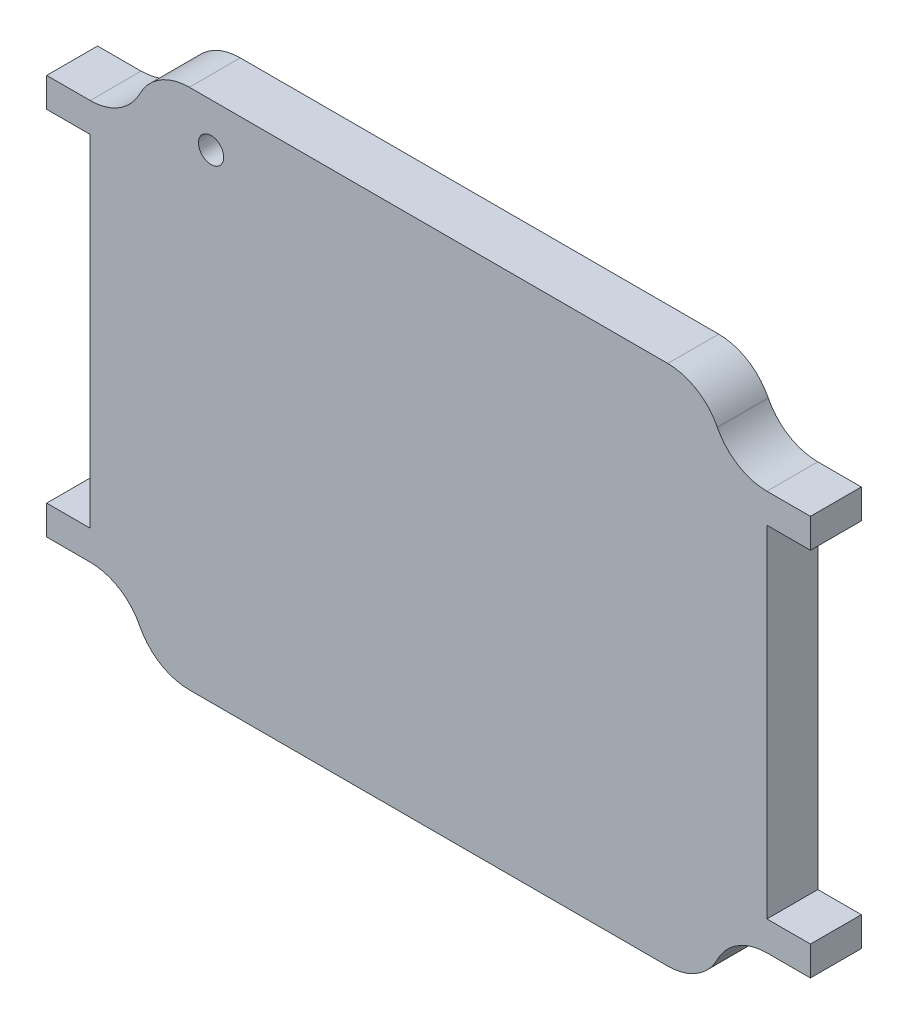
ISO-10303-21;
HEADER;
FILE_DESCRIPTION(('STEP AP214'),'2;1');
FILE_NAME('part.step','',(''),(''),'','','');
FILE_SCHEMA(('AUTOMOTIVE_DESIGN { 1 0 10303 214 1 1 1 1 }'));
ENDSEC;
DATA;
#1=APPLICATION_CONTEXT('core data for automotive mechanical design processes');
#2=APPLICATION_PROTOCOL_DEFINITION('international standard','automotive_design',2000,#1);
#3=PRODUCT_CONTEXT('',#1,'mechanical');
#4=PRODUCT('Part','Part','',(#3));
#5=PRODUCT_RELATED_PRODUCT_CATEGORY('part','',(#4));
#6=PRODUCT_DEFINITION_FORMATION('','',#4);
#7=PRODUCT_DEFINITION_CONTEXT('part definition',#1,'design');
#8=PRODUCT_DEFINITION('design','',#6,#7);
#9=PRODUCT_DEFINITION_SHAPE('','',#8);
#10=(LENGTH_UNIT() NAMED_UNIT(*) SI_UNIT(.MILLI.,.METRE.));
#11=(NAMED_UNIT(*) PLANE_ANGLE_UNIT() SI_UNIT($,.RADIAN.));
#12=(NAMED_UNIT(*) SI_UNIT($,.STERADIAN.) SOLID_ANGLE_UNIT());
#13=UNCERTAINTY_MEASURE_WITH_UNIT(LENGTH_MEASURE(1.E-05),#10,'distance_accuracy_value','');
#14=(GEOMETRIC_REPRESENTATION_CONTEXT(3) GLOBAL_UNCERTAINTY_ASSIGNED_CONTEXT((#13)) GLOBAL_UNIT_ASSIGNED_CONTEXT((#10,
#11,#12)) REPRESENTATION_CONTEXT('',''));
#15=CARTESIAN_POINT('',(0.,0.,0.));
#16=DIRECTION('',(0.,0.,1.));
#17=DIRECTION('',(1.,0.,0.));
#18=AXIS2_PLACEMENT_3D('',#15,#16,#17);
#19=CARTESIAN_POINT('',(-38.9,-29.3632051282051,5.85));
#20=DIRECTION('',(0.,0.,-1.));
#21=DIRECTION('',(-1.,0.,0.));
#22=AXIS2_PLACEMENT_3D('',#19,#20,#21);
#23=PLANE('',#22);
#24=DIRECTION('',(0.,-1.,0.));
#25=VECTOR('',#24,1.);
#26=CARTESIAN_POINT('',(-43.8999999999999,-19.6,5.85));
#27=LINE('',#26,#25);
#28=CARTESIAN_POINT('',(-43.8999999999999,-19.6,5.85));
#29=VERTEX_POINT('',#28);
#30=CARTESIAN_POINT('',(-43.8999999999999,-22.98,5.85));
#31=VERTEX_POINT('',#30);
#32=EDGE_CURVE('E273',#29,#31,#27,.T.);
#33=ORIENTED_EDGE('',*,*,#32,.T.);
#34=DIRECTION('',(1.,0.,0.));
#35=VECTOR('',#34,1.);
#36=CARTESIAN_POINT('',(-43.8999999999999,-22.98,5.85));
#37=LINE('',#36,#35);
#38=CARTESIAN_POINT('',(-38.8999999999999,-22.98,5.85));
#39=VERTEX_POINT('',#38);
#40=EDGE_CURVE('E141',#31,#39,#37,.T.);
#41=ORIENTED_EDGE('',*,*,#40,.T.);
#42=CARTESIAN_POINT('',(-38.9,-29.3632051282051,5.85));
#43=DIRECTION('',(0.,0.,-1.));
#44=DIRECTION('',(-1.,0.,0.));
#45=AXIS2_PLACEMENT_3D('',#42,#43,#44);
#46=CIRCLE('',#45,6.38320512820513);
#47=CARTESIAN_POINT('',(-33.2,-26.49,5.85));
#48=VERTEX_POINT('',#47);
#49=EDGE_CURVE('E336',#39,#48,#46,.T.);
#50=ORIENTED_EDGE('',*,*,#49,.T.);
#51=CARTESIAN_POINT('',(-27.5,-23.6167948717949,5.85));
#52=DIRECTION('',(0.,0.,1.));
#53=DIRECTION('',(1.,0.,0.));
#54=AXIS2_PLACEMENT_3D('',#51,#52,#53);
#55=CIRCLE('',#54,6.38320512820514);
#56=CARTESIAN_POINT('',(-27.5,-30.,5.85));
#57=VERTEX_POINT('',#56);
#58=EDGE_CURVE('E355',#48,#57,#55,.T.);
#59=ORIENTED_EDGE('',*,*,#58,.T.);
#60=DIRECTION('',(1.,0.,0.));
#61=VECTOR('',#60,1.);
#62=CARTESIAN_POINT('',(-27.5,-30.,5.85));
#63=LINE('',#62,#61);
#64=CARTESIAN_POINT('',(27.5,-30.,5.85));
#65=VERTEX_POINT('',#64);
#66=EDGE_CURVE('E352',#57,#65,#63,.T.);
#67=ORIENTED_EDGE('',*,*,#66,.T.);
#68=CARTESIAN_POINT('',(27.5000000000002,-23.6167948717946,5.85));
#69=DIRECTION('',(0.,0.,1.));
#70=DIRECTION('',(-1.,0.,0.));
#71=AXIS2_PLACEMENT_3D('',#68,#69,#70);
#72=CIRCLE('',#71,6.38320512820526);
#73=CARTESIAN_POINT('',(33.2000000000003,-26.4899999999998,5.85));
#74=VERTEX_POINT('',#73);
#75=EDGE_CURVE('E354',#65,#74,#72,.T.);
#76=ORIENTED_EDGE('',*,*,#75,.T.);
#77=CARTESIAN_POINT('',(38.9000000000002,-29.3632051282049,5.85));
#78=DIRECTION('',(0.,0.,-1.));
#79=DIRECTION('',(1.,0.,0.));
#80=AXIS2_PLACEMENT_3D('',#77,#78,#79);
#81=CIRCLE('',#80,6.38320512820514);
#82=CARTESIAN_POINT('',(38.9,-22.9799999999998,5.85));
#83=VERTEX_POINT('',#82);
#84=EDGE_CURVE('E357',#74,#83,#81,.T.);
#85=ORIENTED_EDGE('',*,*,#84,.T.);
#86=DIRECTION('',(1.,0.,0.));
#87=VECTOR('',#86,1.);
#88=CARTESIAN_POINT('',(43.9,-22.9799999999998,5.85));
#89=LINE('',#88,#87);
#90=CARTESIAN_POINT('',(43.9,-22.9799999999998,5.85));
#91=VERTEX_POINT('',#90);
#92=EDGE_CURVE('E363',#83,#91,#89,.T.);
#93=ORIENTED_EDGE('',*,*,#92,.T.);
#94=DIRECTION('',(0.,1.,0.));
#95=VECTOR('',#94,1.);
#96=CARTESIAN_POINT('',(43.9,-19.5999999999998,5.85));
#97=LINE('',#96,#95);
#98=CARTESIAN_POINT('',(43.9,-19.5999999999998,5.85));
#99=VERTEX_POINT('',#98);
#100=EDGE_CURVE('E365',#91,#99,#97,.T.);
#101=ORIENTED_EDGE('',*,*,#100,.T.);
#102=DIRECTION('',(-1.,0.,0.));
#103=VECTOR('',#102,1.);
#104=CARTESIAN_POINT('',(38.9,-19.5999999999998,5.85));
#105=LINE('',#104,#103);
#106=CARTESIAN_POINT('',(38.9,-19.5999999999998,5.85));
#107=VERTEX_POINT('',#106);
#108=EDGE_CURVE('E367',#99,#107,#105,.T.);
#109=ORIENTED_EDGE('',*,*,#108,.T.);
#110=DIRECTION('',(0.,1.,0.));
#111=VECTOR('',#110,1.);
#112=CARTESIAN_POINT('',(38.8999999999997,19.6000000000004,5.85));
#113=LINE('',#112,#111);
#114=CARTESIAN_POINT('',(38.8999999999997,19.6000000000004,5.85));
#115=VERTEX_POINT('',#114);
#116=EDGE_CURVE('E369',#107,#115,#113,.T.);
#117=ORIENTED_EDGE('',*,*,#116,.T.);
#118=DIRECTION('',(1.,0.,0.));
#119=VECTOR('',#118,1.);
#120=CARTESIAN_POINT('',(38.8999999999997,19.6000000000004,5.85));
#121=LINE('',#120,#119);
#122=CARTESIAN_POINT('',(43.8999999999997,19.6000000000004,5.85));
#123=VERTEX_POINT('',#122);
#124=EDGE_CURVE('E371',#115,#123,#121,.T.);
#125=ORIENTED_EDGE('',*,*,#124,.T.);
#126=DIRECTION('',(0.,1.,0.));
#127=VECTOR('',#126,1.);
#128=CARTESIAN_POINT('',(43.8999999999997,19.6000000000004,5.85));
#129=LINE('',#128,#127);
#130=CARTESIAN_POINT('',(43.8999999999997,22.9800000000004,5.85));
#131=VERTEX_POINT('',#130);
#132=EDGE_CURVE('E373',#123,#131,#129,.T.);
#133=ORIENTED_EDGE('',*,*,#132,.T.);
#134=DIRECTION('',(-1.,0.,0.));
#135=VECTOR('',#134,1.);
#136=CARTESIAN_POINT('',(43.8999999999997,22.9800000000004,5.85));
#137=LINE('',#136,#135);
#138=CARTESIAN_POINT('',(38.8999999999997,22.9800000000004,5.85));
#139=VERTEX_POINT('',#138);
#140=EDGE_CURVE('E375',#131,#139,#137,.T.);
#141=ORIENTED_EDGE('',*,*,#140,.T.);
#142=CARTESIAN_POINT('',(38.8999999999998,29.3632051282056,5.85));
#143=DIRECTION('',(0.,0.,-1.));
#144=DIRECTION('',(-1.,0.,0.));
#145=AXIS2_PLACEMENT_3D('',#142,#143,#144);
#146=CIRCLE('',#145,6.38320512820512);
#147=CARTESIAN_POINT('',(33.1999999999998,26.4900000000004,5.85));
#148=VERTEX_POINT('',#147);
#149=EDGE_CURVE('E377',#139,#148,#146,.T.);
#150=ORIENTED_EDGE('',*,*,#149,.T.);
#151=CARTESIAN_POINT('',(27.4999999999998,23.6167948717949,5.85));
#152=DIRECTION('',(0.,0.,1.));
#153=DIRECTION('',(1.,0.,0.));
#154=AXIS2_PLACEMENT_3D('',#151,#152,#153);
#155=CIRCLE('',#154,6.38320512820523);
#156=CARTESIAN_POINT('',(27.5,30.0000000000001,5.85));
#157=VERTEX_POINT('',#156);
#158=EDGE_CURVE('E379',#148,#157,#155,.T.);
#159=ORIENTED_EDGE('',*,*,#158,.T.);
#160=DIRECTION('',(-1.,0.,0.));
#161=VECTOR('',#160,1.);
#162=CARTESIAN_POINT('',(-27.5,30.,5.85));
#163=LINE('',#162,#161);
#164=CARTESIAN_POINT('',(-27.5,30.,5.85));
#165=VERTEX_POINT('',#164);
#166=EDGE_CURVE('E381',#157,#165,#163,.T.);
#167=ORIENTED_EDGE('',*,*,#166,.T.);
#168=CARTESIAN_POINT('',(-27.5,23.6167948717949,5.85));
#169=DIRECTION('',(0.,0.,1.));
#170=DIRECTION('',(-1.,0.,0.));
#171=AXIS2_PLACEMENT_3D('',#168,#169,#170);
#172=CIRCLE('',#171,6.38320512820514);
#173=CARTESIAN_POINT('',(-33.2,26.49,5.85));
#174=VERTEX_POINT('',#173);
#175=EDGE_CURVE('E383',#165,#174,#172,.T.);
#176=ORIENTED_EDGE('',*,*,#175,.T.);
#177=CARTESIAN_POINT('',(-38.9,29.3632051282051,5.85));
#178=DIRECTION('',(0.,0.,-1.));
#179=DIRECTION('',(1.,0.,0.));
#180=AXIS2_PLACEMENT_3D('',#177,#178,#179);
#181=CIRCLE('',#180,6.38320512820513);
#182=CARTESIAN_POINT('',(-38.8999999999999,22.98,5.85));
#183=VERTEX_POINT('',#182);
#184=EDGE_CURVE('E385',#174,#183,#181,.T.);
#185=ORIENTED_EDGE('',*,*,#184,.T.);
#186=DIRECTION('',(-1.,0.,0.));
#187=VECTOR('',#186,1.);
#188=CARTESIAN_POINT('',(-43.8999999999999,22.98,5.85));
#189=LINE('',#188,#187);
#190=CARTESIAN_POINT('',(-43.8999999999999,22.98,5.85));
#191=VERTEX_POINT('',#190);
#192=EDGE_CURVE('E387',#183,#191,#189,.T.);
#193=ORIENTED_EDGE('',*,*,#192,.T.);
#194=DIRECTION('',(0.,-1.,0.));
#195=VECTOR('',#194,1.);
#196=CARTESIAN_POINT('',(-43.8999999999999,19.6,5.85));
#197=LINE('',#196,#195);
#198=CARTESIAN_POINT('',(-43.8999999999999,19.6,5.85));
#199=VERTEX_POINT('',#198);
#200=EDGE_CURVE('E208',#191,#199,#197,.T.);
#201=ORIENTED_EDGE('',*,*,#200,.T.);
#202=DIRECTION('',(1.,0.,0.));
#203=VECTOR('',#202,1.);
#204=CARTESIAN_POINT('',(-38.8999999999999,19.6,5.85));
#205=LINE('',#204,#203);
#206=CARTESIAN_POINT('',(-38.8999999999999,19.6,5.85));
#207=VERTEX_POINT('',#206);
#208=EDGE_CURVE('E202',#199,#207,#205,.T.);
#209=ORIENTED_EDGE('',*,*,#208,.T.);
#210=DIRECTION('',(0.,-1.,0.));
#211=VECTOR('',#210,1.);
#212=CARTESIAN_POINT('',(-38.8999999999999,19.6,5.85));
#213=LINE('',#212,#211);
#214=CARTESIAN_POINT('',(-38.8999999999999,-19.6,5.85));
#215=VERTEX_POINT('',#214);
#216=EDGE_CURVE('E206',#207,#215,#213,.T.);
#217=ORIENTED_EDGE('',*,*,#216,.T.);
#218=DIRECTION('',(-1.,0.,0.));
#219=VECTOR('',#218,1.);
#220=CARTESIAN_POINT('',(-38.8999999999999,-19.6,5.85));
#221=LINE('',#220,#219);
#222=EDGE_CURVE('E50',#215,#29,#221,.T.);
#223=ORIENTED_EDGE('',*,*,#222,.T.);
#224=EDGE_LOOP('',(#33,#41,#50,#59,#67,#76,#85,#93,#101,#109,#117,#125,#133,#141,#150,#159,#167,
#176,#185,#193,#201,#209,#217,#223));
#225=FACE_BOUND('',#224,.T.);
#226=CARTESIAN_POINT('',(-25.,24.9999999999999,5.85));
#227=DIRECTION('',(0.,0.,1.));
#228=DIRECTION('',(1.,0.,0.));
#229=AXIS2_PLACEMENT_3D('',#226,#227,#228);
#230=CIRCLE('',#229,1.45);
#231=CARTESIAN_POINT('',(-23.55,24.9999999999999,5.85));
#232=VERTEX_POINT('',#231);
#233=EDGE_CURVE('E230',#232,#232,#230,.T.);
#234=ORIENTED_EDGE('',*,*,#233,.F.);
#235=EDGE_LOOP('',(#234));
#236=FACE_BOUND('',#235,.T.);
#237=ADVANCED_FACE('F33',(#225,#236),#23,.F.);
#238=CARTESIAN_POINT('',(-38.9,-29.3632051282051,0.));
#239=DIRECTION('',(0.,0.,-1.));
#240=DIRECTION('',(-1.,0.,0.));
#241=AXIS2_PLACEMENT_3D('',#238,#239,#240);
#242=PLANE('',#241);
#243=DIRECTION('',(0.,-1.,0.));
#244=VECTOR('',#243,1.);
#245=CARTESIAN_POINT('',(-43.8999999999999,-19.6,0.));
#246=LINE('',#245,#244);
#247=CARTESIAN_POINT('',(-43.8999999999999,-19.6,0.));
#248=VERTEX_POINT('',#247);
#249=CARTESIAN_POINT('',(-43.8999999999999,-22.98,0.));
#250=VERTEX_POINT('',#249);
#251=EDGE_CURVE('E226',#248,#250,#246,.T.);
#252=ORIENTED_EDGE('',*,*,#251,.F.);
#253=DIRECTION('',(-1.,0.,0.));
#254=VECTOR('',#253,1.);
#255=CARTESIAN_POINT('',(-38.8999999999999,-19.6,0.));
#256=LINE('',#255,#254);
#257=CARTESIAN_POINT('',(-38.8999999999999,-19.6,0.));
#258=VERTEX_POINT('',#257);
#259=EDGE_CURVE('E133',#258,#248,#256,.T.);
#260=ORIENTED_EDGE('',*,*,#259,.F.);
#261=DIRECTION('',(0.,-1.,0.));
#262=VECTOR('',#261,1.);
#263=CARTESIAN_POINT('',(-38.8999999999999,19.6,0.));
#264=LINE('',#263,#262);
#265=CARTESIAN_POINT('',(-38.8999999999999,19.6,0.));
#266=VERTEX_POINT('',#265);
#267=EDGE_CURVE('E127',#266,#258,#264,.T.);
#268=ORIENTED_EDGE('',*,*,#267,.F.);
#269=DIRECTION('',(1.,0.,0.));
#270=VECTOR('',#269,1.);
#271=CARTESIAN_POINT('',(-38.8999999999999,19.6,0.));
#272=LINE('',#271,#270);
#273=CARTESIAN_POINT('',(-43.8999999999999,19.6,0.));
#274=VERTEX_POINT('',#273);
#275=EDGE_CURVE('E216',#274,#266,#272,.T.);
#276=ORIENTED_EDGE('',*,*,#275,.F.);
#277=DIRECTION('',(0.,-1.,0.));
#278=VECTOR('',#277,1.);
#279=CARTESIAN_POINT('',(-43.8999999999999,19.6,0.));
#280=LINE('',#279,#278);
#281=CARTESIAN_POINT('',(-43.8999999999999,22.98,0.));
#282=VERTEX_POINT('',#281);
#283=EDGE_CURVE('E268',#282,#274,#280,.T.);
#284=ORIENTED_EDGE('',*,*,#283,.F.);
#285=DIRECTION('',(-1.,0.,0.));
#286=VECTOR('',#285,1.);
#287=CARTESIAN_POINT('',(-43.8999999999999,22.98,0.));
#288=LINE('',#287,#286);
#289=CARTESIAN_POINT('',(-38.8999999999999,22.98,0.));
#290=VERTEX_POINT('',#289);
#291=EDGE_CURVE('E266',#290,#282,#288,.T.);
#292=ORIENTED_EDGE('',*,*,#291,.F.);
#293=CARTESIAN_POINT('',(-38.9,29.3632051282051,0.));
#294=DIRECTION('',(0.,0.,-1.));
#295=DIRECTION('',(1.,0.,0.));
#296=AXIS2_PLACEMENT_3D('',#293,#294,#295);
#297=CIRCLE('',#296,6.38320512820513);
#298=CARTESIAN_POINT('',(-33.2,26.49,0.));
#299=VERTEX_POINT('',#298);
#300=EDGE_CURVE('E264',#299,#290,#297,.T.);
#301=ORIENTED_EDGE('',*,*,#300,.F.);
#302=CARTESIAN_POINT('',(-27.5,23.6167948717949,0.));
#303=DIRECTION('',(0.,0.,1.));
#304=DIRECTION('',(-1.,0.,0.));
#305=AXIS2_PLACEMENT_3D('',#302,#303,#304);
#306=CIRCLE('',#305,6.38320512820514);
#307=CARTESIAN_POINT('',(-27.5,30.,0.));
#308=VERTEX_POINT('',#307);
#309=EDGE_CURVE('E262',#308,#299,#306,.T.);
#310=ORIENTED_EDGE('',*,*,#309,.F.);
#311=DIRECTION('',(-1.,0.,0.));
#312=VECTOR('',#311,1.);
#313=CARTESIAN_POINT('',(-27.5,30.,0.));
#314=LINE('',#313,#312);
#315=CARTESIAN_POINT('',(27.5,30.0000000000001,0.));
#316=VERTEX_POINT('',#315);
#317=EDGE_CURVE('E260',#316,#308,#314,.T.);
#318=ORIENTED_EDGE('',*,*,#317,.F.);
#319=CARTESIAN_POINT('',(27.4999999999998,23.6167948717949,0.));
#320=DIRECTION('',(0.,0.,1.));
#321=DIRECTION('',(1.,0.,0.));
#322=AXIS2_PLACEMENT_3D('',#319,#320,#321);
#323=CIRCLE('',#322,6.38320512820523);
#324=CARTESIAN_POINT('',(33.1999999999998,26.4900000000004,0.));
#325=VERTEX_POINT('',#324);
#326=EDGE_CURVE('E258',#325,#316,#323,.T.);
#327=ORIENTED_EDGE('',*,*,#326,.F.);
#328=CARTESIAN_POINT('',(38.8999999999998,29.3632051282056,0.));
#329=DIRECTION('',(0.,0.,-1.));
#330=DIRECTION('',(-1.,0.,0.));
#331=AXIS2_PLACEMENT_3D('',#328,#329,#330);
#332=CIRCLE('',#331,6.38320512820512);
#333=CARTESIAN_POINT('',(38.8999999999997,22.9800000000004,0.));
#334=VERTEX_POINT('',#333);
#335=EDGE_CURVE('E256',#334,#325,#332,.T.);
#336=ORIENTED_EDGE('',*,*,#335,.F.);
#337=DIRECTION('',(-1.,0.,0.));
#338=VECTOR('',#337,1.);
#339=CARTESIAN_POINT('',(43.8999999999997,22.9800000000004,0.));
#340=LINE('',#339,#338);
#341=CARTESIAN_POINT('',(43.8999999999997,22.9800000000004,0.));
#342=VERTEX_POINT('',#341);
#343=EDGE_CURVE('E254',#342,#334,#340,.T.);
#344=ORIENTED_EDGE('',*,*,#343,.F.);
#345=DIRECTION('',(0.,1.,0.));
#346=VECTOR('',#345,1.);
#347=CARTESIAN_POINT('',(43.8999999999997,19.6000000000004,0.));
#348=LINE('',#347,#346);
#349=CARTESIAN_POINT('',(43.8999999999997,19.6000000000004,0.));
#350=VERTEX_POINT('',#349);
#351=EDGE_CURVE('E252',#350,#342,#348,.T.);
#352=ORIENTED_EDGE('',*,*,#351,.F.);
#353=DIRECTION('',(1.,0.,0.));
#354=VECTOR('',#353,1.);
#355=CARTESIAN_POINT('',(38.8999999999997,19.6000000000004,0.));
#356=LINE('',#355,#354);
#357=CARTESIAN_POINT('',(38.8999999999997,19.6000000000004,0.));
#358=VERTEX_POINT('',#357);
#359=EDGE_CURVE('E250',#358,#350,#356,.T.);
#360=ORIENTED_EDGE('',*,*,#359,.F.);
#361=DIRECTION('',(0.,1.,0.));
#362=VECTOR('',#361,1.);
#363=CARTESIAN_POINT('',(38.8999999999997,19.6000000000004,0.));
#364=LINE('',#363,#362);
#365=CARTESIAN_POINT('',(38.9,-19.5999999999998,0.));
#366=VERTEX_POINT('',#365);
#367=EDGE_CURVE('E248',#366,#358,#364,.T.);
#368=ORIENTED_EDGE('',*,*,#367,.F.);
#369=DIRECTION('',(-1.,0.,0.));
#370=VECTOR('',#369,1.);
#371=CARTESIAN_POINT('',(38.9,-19.5999999999998,0.));
#372=LINE('',#371,#370);
#373=CARTESIAN_POINT('',(43.9,-19.5999999999998,0.));
#374=VERTEX_POINT('',#373);
#375=EDGE_CURVE('E246',#374,#366,#372,.T.);
#376=ORIENTED_EDGE('',*,*,#375,.F.);
#377=DIRECTION('',(0.,1.,0.));
#378=VECTOR('',#377,1.);
#379=CARTESIAN_POINT('',(43.9,-19.5999999999998,0.));
#380=LINE('',#379,#378);
#381=CARTESIAN_POINT('',(43.9,-22.9799999999998,0.));
#382=VERTEX_POINT('',#381);
#383=EDGE_CURVE('E244',#382,#374,#380,.T.);
#384=ORIENTED_EDGE('',*,*,#383,.F.);
#385=DIRECTION('',(1.,0.,0.));
#386=VECTOR('',#385,1.);
#387=CARTESIAN_POINT('',(43.9,-22.9799999999998,0.));
#388=LINE('',#387,#386);
#389=CARTESIAN_POINT('',(38.9,-22.9799999999998,0.));
#390=VERTEX_POINT('',#389);
#391=EDGE_CURVE('E242',#390,#382,#388,.T.);
#392=ORIENTED_EDGE('',*,*,#391,.F.);
#393=CARTESIAN_POINT('',(38.9000000000002,-29.3632051282049,0.));
#394=DIRECTION('',(0.,0.,-1.));
#395=DIRECTION('',(1.,0.,0.));
#396=AXIS2_PLACEMENT_3D('',#393,#394,#395);
#397=CIRCLE('',#396,6.38320512820514);
#398=CARTESIAN_POINT('',(33.2000000000003,-26.4899999999998,0.));
#399=VERTEX_POINT('',#398);
#400=EDGE_CURVE('E240',#399,#390,#397,.T.);
#401=ORIENTED_EDGE('',*,*,#400,.F.);
#402=CARTESIAN_POINT('',(27.5000000000002,-23.6167948717946,0.));
#403=DIRECTION('',(0.,0.,1.));
#404=DIRECTION('',(-1.,0.,0.));
#405=AXIS2_PLACEMENT_3D('',#402,#403,#404);
#406=CIRCLE('',#405,6.38320512820526);
#407=CARTESIAN_POINT('',(27.5,-30.,0.));
#408=VERTEX_POINT('',#407);
#409=EDGE_CURVE('E238',#408,#399,#406,.T.);
#410=ORIENTED_EDGE('',*,*,#409,.F.);
#411=DIRECTION('',(1.,0.,0.));
#412=VECTOR('',#411,1.);
#413=CARTESIAN_POINT('',(-27.5,-30.,0.));
#414=LINE('',#413,#412);
#415=CARTESIAN_POINT('',(-27.5,-30.,0.));
#416=VERTEX_POINT('',#415);
#417=EDGE_CURVE('E236',#416,#408,#414,.T.);
#418=ORIENTED_EDGE('',*,*,#417,.F.);
#419=CARTESIAN_POINT('',(-27.5,-23.6167948717949,0.));
#420=DIRECTION('',(0.,0.,1.));
#421=DIRECTION('',(1.,0.,0.));
#422=AXIS2_PLACEMENT_3D('',#419,#420,#421);
#423=CIRCLE('',#422,6.38320512820514);
#424=CARTESIAN_POINT('',(-33.2,-26.49,0.));
#425=VERTEX_POINT('',#424);
#426=EDGE_CURVE('E234',#425,#416,#423,.T.);
#427=ORIENTED_EDGE('',*,*,#426,.F.);
#428=CARTESIAN_POINT('',(-38.9,-29.3632051282051,0.));
#429=DIRECTION('',(0.,0.,-1.));
#430=DIRECTION('',(-1.,0.,0.));
#431=AXIS2_PLACEMENT_3D('',#428,#429,#430);
#432=CIRCLE('',#431,6.38320512820513);
#433=CARTESIAN_POINT('',(-38.8999999999999,-22.98,0.));
#434=VERTEX_POINT('',#433);
#435=EDGE_CURVE('E232',#434,#425,#432,.T.);
#436=ORIENTED_EDGE('',*,*,#435,.F.);
#437=DIRECTION('',(1.,0.,0.));
#438=VECTOR('',#437,1.);
#439=CARTESIAN_POINT('',(-43.8999999999999,-22.98,0.));
#440=LINE('',#439,#438);
#441=EDGE_CURVE('E229',#250,#434,#440,.T.);
#442=ORIENTED_EDGE('',*,*,#441,.F.);
#443=EDGE_LOOP('',(#252,#260,#268,#276,#284,#292,#301,#310,#318,#327,#336,#344,#352,#360,#368,
#376,#384,#392,#401,#410,#418,#427,#436,#442));
#444=FACE_BOUND('',#443,.T.);
#445=CARTESIAN_POINT('',(-25.,24.9999999999999,0.));
#446=DIRECTION('',(0.,0.,1.));
#447=DIRECTION('',(1.,0.,0.));
#448=AXIS2_PLACEMENT_3D('',#445,#446,#447);
#449=CIRCLE('',#448,1.45);
#450=CARTESIAN_POINT('',(-23.55,24.9999999999999,0.));
#451=VERTEX_POINT('',#450);
#452=EDGE_CURVE('E690',#451,#451,#449,.T.);
#453=ORIENTED_EDGE('',*,*,#452,.T.);
#454=EDGE_LOOP('',(#453));
#455=FACE_BOUND('',#454,.T.);
#456=ADVANCED_FACE('F340',(#444,#455),#242,.T.);
#457=CARTESIAN_POINT('',(-43.8999999999999,-19.6,5.85));
#458=DIRECTION('',(1.,0.,0.));
#459=DIRECTION('',(0.,0.,-1.));
#460=AXIS2_PLACEMENT_3D('',#457,#458,#459);
#461=PLANE('',#460);
#462=ORIENTED_EDGE('',*,*,#251,.T.);
#463=DIRECTION('',(0.,0.,-1.));
#464=VECTOR('',#463,1.);
#465=CARTESIAN_POINT('',(-43.8999999999999,-22.98,5.85));
#466=LINE('',#465,#464);
#467=EDGE_CURVE('E11',#31,#250,#466,.T.);
#468=ORIENTED_EDGE('',*,*,#467,.F.);
#469=ORIENTED_EDGE('',*,*,#32,.F.);
#470=DIRECTION('',(0.,0.,-1.));
#471=VECTOR('',#470,1.);
#472=CARTESIAN_POINT('',(-43.8999999999999,-19.6,5.85));
#473=LINE('',#472,#471);
#474=EDGE_CURVE('E222',#29,#248,#473,.T.);
#475=ORIENTED_EDGE('',*,*,#474,.T.);
#476=EDGE_LOOP('',(#462,#468,#469,#475));
#477=FACE_BOUND('',#476,.T.);
#478=ADVANCED_FACE('F35',(#477),#461,.F.);
#479=CARTESIAN_POINT('',(-43.8999999999999,-22.98,5.85));
#480=DIRECTION('',(0.,1.,0.));
#481=DIRECTION('',(0.,0.,1.));
#482=AXIS2_PLACEMENT_3D('',#479,#480,#481);
#483=PLANE('',#482);
#484=ORIENTED_EDGE('',*,*,#441,.T.);
#485=DIRECTION('',(0.,0.,-1.));
#486=VECTOR('',#485,1.);
#487=CARTESIAN_POINT('',(-38.8999999999999,-22.98,5.85));
#488=LINE('',#487,#486);
#489=EDGE_CURVE('E42',#39,#434,#488,.T.);
#490=ORIENTED_EDGE('',*,*,#489,.F.);
#491=ORIENTED_EDGE('',*,*,#40,.F.);
#492=ORIENTED_EDGE('',*,*,#467,.T.);
#493=EDGE_LOOP('',(#484,#490,#491,#492));
#494=FACE_BOUND('',#493,.T.);
#495=ADVANCED_FACE('F421',(#494),#483,.F.);
#496=CARTESIAN_POINT('',(-38.9,-29.3632051282051,5.85));
#497=DIRECTION('',(0.,0.,-1.));
#498=DIRECTION('',(-1.,0.,0.));
#499=AXIS2_PLACEMENT_3D('',#496,#497,#498);
#500=CYLINDRICAL_SURFACE('',#499,6.38320512820513);
#501=ORIENTED_EDGE('',*,*,#435,.T.);
#502=DIRECTION('',(0.,0.,-1.));
#503=VECTOR('',#502,1.);
#504=CARTESIAN_POINT('',(-33.2,-26.49,5.85));
#505=LINE('',#504,#503);
#506=EDGE_CURVE('E328',#48,#425,#505,.T.);
#507=ORIENTED_EDGE('',*,*,#506,.F.);
#508=ORIENTED_EDGE('',*,*,#49,.F.);
#509=ORIENTED_EDGE('',*,*,#489,.T.);
#510=EDGE_LOOP('',(#501,#507,#508,#509));
#511=FACE_BOUND('',#510,.T.);
#512=ADVANCED_FACE('F334',(#511),#500,.F.);
#513=CARTESIAN_POINT('',(-27.5,-23.6167948717949,5.85));
#514=DIRECTION('',(0.,0.,-1.));
#515=DIRECTION('',(-1.,0.,0.));
#516=AXIS2_PLACEMENT_3D('',#513,#514,#515);
#517=CYLINDRICAL_SURFACE('',#516,6.38320512820514);
#518=ORIENTED_EDGE('',*,*,#426,.T.);
#519=DIRECTION('',(0.,0.,-1.));
#520=VECTOR('',#519,1.);
#521=CARTESIAN_POINT('',(-27.5,-30.,5.85));
#522=LINE('',#521,#520);
#523=EDGE_CURVE('E325',#57,#416,#522,.T.);
#524=ORIENTED_EDGE('',*,*,#523,.F.);
#525=ORIENTED_EDGE('',*,*,#58,.F.);
#526=ORIENTED_EDGE('',*,*,#506,.T.);
#527=EDGE_LOOP('',(#518,#524,#525,#526));
#528=FACE_BOUND('',#527,.T.);
#529=ADVANCED_FACE('F346',(#528),#517,.T.);
#530=CARTESIAN_POINT('',(-27.5,-30.,5.85));
#531=DIRECTION('',(0.,1.,0.));
#532=DIRECTION('',(0.,0.,1.));
#533=AXIS2_PLACEMENT_3D('',#530,#531,#532);
#534=PLANE('',#533);
#535=ORIENTED_EDGE('',*,*,#417,.T.);
#536=DIRECTION('',(0.,0.,-1.));
#537=VECTOR('',#536,1.);
#538=CARTESIAN_POINT('',(27.5,-30.,5.85));
#539=LINE('',#538,#537);
#540=EDGE_CURVE('E322',#65,#408,#539,.T.);
#541=ORIENTED_EDGE('',*,*,#540,.F.);
#542=ORIENTED_EDGE('',*,*,#66,.F.);
#543=ORIENTED_EDGE('',*,*,#523,.T.);
#544=EDGE_LOOP('',(#535,#541,#542,#543));
#545=FACE_BOUND('',#544,.T.);
#546=ADVANCED_FACE('F350',(#545),#534,.F.);
#547=CARTESIAN_POINT('',(27.5000000000002,-23.6167948717946,5.85));
#548=DIRECTION('',(0.,0.,-1.));
#549=DIRECTION('',(-1.,0.,0.));
#550=AXIS2_PLACEMENT_3D('',#547,#548,#549);
#551=CYLINDRICAL_SURFACE('',#550,6.38320512820526);
#552=ORIENTED_EDGE('',*,*,#409,.T.);
#553=DIRECTION('',(0.,0.,-1.));
#554=VECTOR('',#553,1.);
#555=CARTESIAN_POINT('',(33.2000000000003,-26.4899999999998,5.85));
#556=LINE('',#555,#554);
#557=EDGE_CURVE('E319',#74,#399,#556,.T.);
#558=ORIENTED_EDGE('',*,*,#557,.F.);
#559=ORIENTED_EDGE('',*,*,#75,.F.);
#560=ORIENTED_EDGE('',*,*,#540,.T.);
#561=EDGE_LOOP('',(#552,#558,#559,#560));
#562=FACE_BOUND('',#561,.T.);
#563=ADVANCED_FACE('F434',(#562),#551,.T.);
#564=CARTESIAN_POINT('',(38.9000000000002,-29.3632051282049,5.85));
#565=DIRECTION('',(0.,0.,-1.));
#566=DIRECTION('',(-1.,0.,0.));
#567=AXIS2_PLACEMENT_3D('',#564,#565,#566);
#568=CYLINDRICAL_SURFACE('',#567,6.38320512820514);
#569=ORIENTED_EDGE('',*,*,#400,.T.);
#570=DIRECTION('',(0.,0.,-1.));
#571=VECTOR('',#570,1.);
#572=CARTESIAN_POINT('',(38.9,-22.9799999999998,5.85));
#573=LINE('',#572,#571);
#574=EDGE_CURVE('E316',#83,#390,#573,.T.);
#575=ORIENTED_EDGE('',*,*,#574,.F.);
#576=ORIENTED_EDGE('',*,*,#84,.F.);
#577=ORIENTED_EDGE('',*,*,#557,.T.);
#578=EDGE_LOOP('',(#569,#575,#576,#577));
#579=FACE_BOUND('',#578,.T.);
#580=ADVANCED_FACE('F437',(#579),#568,.F.);
#581=CARTESIAN_POINT('',(43.9,-22.9799999999998,5.85));
#582=DIRECTION('',(0.,1.,0.));
#583=DIRECTION('',(0.,0.,1.));
#584=AXIS2_PLACEMENT_3D('',#581,#582,#583);
#585=PLANE('',#584);
#586=ORIENTED_EDGE('',*,*,#391,.T.);
#587=DIRECTION('',(0.,0.,-1.));
#588=VECTOR('',#587,1.);
#589=CARTESIAN_POINT('',(43.9,-22.9799999999998,5.85));
#590=LINE('',#589,#588);
#591=EDGE_CURVE('E313',#91,#382,#590,.T.);
#592=ORIENTED_EDGE('',*,*,#591,.F.);
#593=ORIENTED_EDGE('',*,*,#92,.F.);
#594=ORIENTED_EDGE('',*,*,#574,.T.);
#595=EDGE_LOOP('',(#586,#592,#593,#594));
#596=FACE_BOUND('',#595,.T.);
#597=ADVANCED_FACE('F441',(#596),#585,.F.);
#598=CARTESIAN_POINT('',(43.9,-19.5999999999998,5.85));
#599=DIRECTION('',(-1.,0.,0.));
#600=DIRECTION('',(0.,-1.,0.));
#601=AXIS2_PLACEMENT_3D('',#598,#599,#600);
#602=PLANE('',#601);
#603=ORIENTED_EDGE('',*,*,#383,.T.);
#604=DIRECTION('',(0.,0.,-1.));
#605=VECTOR('',#604,1.);
#606=CARTESIAN_POINT('',(43.9,-19.5999999999998,5.85));
#607=LINE('',#606,#605);
#608=EDGE_CURVE('E310',#99,#374,#607,.T.);
#609=ORIENTED_EDGE('',*,*,#608,.F.);
#610=ORIENTED_EDGE('',*,*,#100,.F.);
#611=ORIENTED_EDGE('',*,*,#591,.T.);
#612=EDGE_LOOP('',(#603,#609,#610,#611));
#613=FACE_BOUND('',#612,.T.);
#614=ADVANCED_FACE('F445',(#613),#602,.F.);
#615=CARTESIAN_POINT('',(38.9,-19.5999999999998,5.85));
#616=DIRECTION('',(0.,-1.,0.));
#617=DIRECTION('',(0.,0.,-1.));
#618=AXIS2_PLACEMENT_3D('',#615,#616,#617);
#619=PLANE('',#618);
#620=ORIENTED_EDGE('',*,*,#375,.T.);
#621=DIRECTION('',(0.,0.,-1.));
#622=VECTOR('',#621,1.);
#623=CARTESIAN_POINT('',(38.9,-19.5999999999998,5.85));
#624=LINE('',#623,#622);
#625=EDGE_CURVE('E307',#107,#366,#624,.T.);
#626=ORIENTED_EDGE('',*,*,#625,.F.);
#627=ORIENTED_EDGE('',*,*,#108,.F.);
#628=ORIENTED_EDGE('',*,*,#608,.T.);
#629=EDGE_LOOP('',(#620,#626,#627,#628));
#630=FACE_BOUND('',#629,.T.);
#631=ADVANCED_FACE('F449',(#630),#619,.F.);
#632=CARTESIAN_POINT('',(38.8999999999997,19.6000000000004,5.85));
#633=DIRECTION('',(-1.,0.,0.));
#634=DIRECTION('',(0.,-1.,0.));
#635=AXIS2_PLACEMENT_3D('',#632,#633,#634);
#636=PLANE('',#635);
#637=ORIENTED_EDGE('',*,*,#367,.T.);
#638=DIRECTION('',(0.,0.,-1.));
#639=VECTOR('',#638,1.);
#640=CARTESIAN_POINT('',(38.8999999999997,19.6000000000004,5.85));
#641=LINE('',#640,#639);
#642=EDGE_CURVE('E304',#115,#358,#641,.T.);
#643=ORIENTED_EDGE('',*,*,#642,.F.);
#644=ORIENTED_EDGE('',*,*,#116,.F.);
#645=ORIENTED_EDGE('',*,*,#625,.T.);
#646=EDGE_LOOP('',(#637,#643,#644,#645));
#647=FACE_BOUND('',#646,.T.);
#648=ADVANCED_FACE('F453',(#647),#636,.F.);
#649=CARTESIAN_POINT('',(38.8999999999997,19.6000000000004,5.85));
#650=DIRECTION('',(0.,1.,0.));
#651=DIRECTION('',(0.,0.,1.));
#652=AXIS2_PLACEMENT_3D('',#649,#650,#651);
#653=PLANE('',#652);
#654=ORIENTED_EDGE('',*,*,#359,.T.);
#655=DIRECTION('',(0.,0.,-1.));
#656=VECTOR('',#655,1.);
#657=CARTESIAN_POINT('',(43.8999999999997,19.6000000000004,5.85));
#658=LINE('',#657,#656);
#659=EDGE_CURVE('E301',#123,#350,#658,.T.);
#660=ORIENTED_EDGE('',*,*,#659,.F.);
#661=ORIENTED_EDGE('',*,*,#124,.F.);
#662=ORIENTED_EDGE('',*,*,#642,.T.);
#663=EDGE_LOOP('',(#654,#660,#661,#662));
#664=FACE_BOUND('',#663,.T.);
#665=ADVANCED_FACE('F457',(#664),#653,.F.);
#666=CARTESIAN_POINT('',(43.8999999999997,19.6000000000004,5.85));
#667=DIRECTION('',(-1.,0.,0.));
#668=DIRECTION('',(0.,-1.,0.));
#669=AXIS2_PLACEMENT_3D('',#666,#667,#668);
#670=PLANE('',#669);
#671=ORIENTED_EDGE('',*,*,#351,.T.);
#672=DIRECTION('',(0.,0.,-1.));
#673=VECTOR('',#672,1.);
#674=CARTESIAN_POINT('',(43.8999999999997,22.9800000000004,5.85));
#675=LINE('',#674,#673);
#676=EDGE_CURVE('E298',#131,#342,#675,.T.);
#677=ORIENTED_EDGE('',*,*,#676,.F.);
#678=ORIENTED_EDGE('',*,*,#132,.F.);
#679=ORIENTED_EDGE('',*,*,#659,.T.);
#680=EDGE_LOOP('',(#671,#677,#678,#679));
#681=FACE_BOUND('',#680,.T.);
#682=ADVANCED_FACE('F461',(#681),#670,.F.);
#683=CARTESIAN_POINT('',(43.8999999999997,22.9800000000004,5.85));
#684=DIRECTION('',(0.,-1.,0.));
#685=DIRECTION('',(0.,0.,-1.));
#686=AXIS2_PLACEMENT_3D('',#683,#684,#685);
#687=PLANE('',#686);
#688=ORIENTED_EDGE('',*,*,#343,.T.);
#689=DIRECTION('',(0.,0.,-1.));
#690=VECTOR('',#689,1.);
#691=CARTESIAN_POINT('',(38.8999999999997,22.9800000000004,5.85));
#692=LINE('',#691,#690);
#693=EDGE_CURVE('E295',#139,#334,#692,.T.);
#694=ORIENTED_EDGE('',*,*,#693,.F.);
#695=ORIENTED_EDGE('',*,*,#140,.F.);
#696=ORIENTED_EDGE('',*,*,#676,.T.);
#697=EDGE_LOOP('',(#688,#694,#695,#696));
#698=FACE_BOUND('',#697,.T.);
#699=ADVANCED_FACE('F465',(#698),#687,.F.);
#700=CARTESIAN_POINT('',(38.8999999999998,29.3632051282056,5.85));
#701=DIRECTION('',(0.,0.,-1.));
#702=DIRECTION('',(-1.,0.,0.));
#703=AXIS2_PLACEMENT_3D('',#700,#701,#702);
#704=CYLINDRICAL_SURFACE('',#703,6.38320512820512);
#705=ORIENTED_EDGE('',*,*,#335,.T.);
#706=DIRECTION('',(0.,0.,-1.));
#707=VECTOR('',#706,1.);
#708=CARTESIAN_POINT('',(33.1999999999998,26.4900000000004,5.85));
#709=LINE('',#708,#707);
#710=EDGE_CURVE('E292',#148,#325,#709,.T.);
#711=ORIENTED_EDGE('',*,*,#710,.F.);
#712=ORIENTED_EDGE('',*,*,#149,.F.);
#713=ORIENTED_EDGE('',*,*,#693,.T.);
#714=EDGE_LOOP('',(#705,#711,#712,#713));
#715=FACE_BOUND('',#714,.T.);
#716=ADVANCED_FACE('F469',(#715),#704,.F.);
#717=CARTESIAN_POINT('',(27.4999999999998,23.6167948717949,5.85));
#718=DIRECTION('',(0.,0.,-1.));
#719=DIRECTION('',(-1.,0.,0.));
#720=AXIS2_PLACEMENT_3D('',#717,#718,#719);
#721=CYLINDRICAL_SURFACE('',#720,6.38320512820523);
#722=ORIENTED_EDGE('',*,*,#326,.T.);
#723=DIRECTION('',(0.,0.,-1.));
#724=VECTOR('',#723,1.);
#725=CARTESIAN_POINT('',(27.5,30.0000000000001,5.85));
#726=LINE('',#725,#724);
#727=EDGE_CURVE('E289',#157,#316,#726,.T.);
#728=ORIENTED_EDGE('',*,*,#727,.F.);
#729=ORIENTED_EDGE('',*,*,#158,.F.);
#730=ORIENTED_EDGE('',*,*,#710,.T.);
#731=EDGE_LOOP('',(#722,#728,#729,#730));
#732=FACE_BOUND('',#731,.T.);
#733=ADVANCED_FACE('F473',(#732),#721,.T.);
#734=CARTESIAN_POINT('',(-27.5,30.,5.85));
#735=DIRECTION('',(0.,-1.,0.));
#736=DIRECTION('',(0.,0.,-1.));
#737=AXIS2_PLACEMENT_3D('',#734,#735,#736);
#738=PLANE('',#737);
#739=ORIENTED_EDGE('',*,*,#317,.T.);
#740=DIRECTION('',(0.,0.,-1.));
#741=VECTOR('',#740,1.);
#742=CARTESIAN_POINT('',(-27.5,30.,5.85));
#743=LINE('',#742,#741);
#744=EDGE_CURVE('E286',#165,#308,#743,.T.);
#745=ORIENTED_EDGE('',*,*,#744,.F.);
#746=ORIENTED_EDGE('',*,*,#166,.F.);
#747=ORIENTED_EDGE('',*,*,#727,.T.);
#748=EDGE_LOOP('',(#739,#745,#746,#747));
#749=FACE_BOUND('',#748,.T.);
#750=ADVANCED_FACE('F477',(#749),#738,.F.);
#751=CARTESIAN_POINT('',(-27.5,23.6167948717949,5.85));
#752=DIRECTION('',(0.,0.,-1.));
#753=DIRECTION('',(-1.,0.,0.));
#754=AXIS2_PLACEMENT_3D('',#751,#752,#753);
#755=CYLINDRICAL_SURFACE('',#754,6.38320512820514);
#756=ORIENTED_EDGE('',*,*,#309,.T.);
#757=DIRECTION('',(0.,0.,-1.));
#758=VECTOR('',#757,1.);
#759=CARTESIAN_POINT('',(-33.2,26.49,5.85));
#760=LINE('',#759,#758);
#761=EDGE_CURVE('E283',#174,#299,#760,.T.);
#762=ORIENTED_EDGE('',*,*,#761,.F.);
#763=ORIENTED_EDGE('',*,*,#175,.F.);
#764=ORIENTED_EDGE('',*,*,#744,.T.);
#765=EDGE_LOOP('',(#756,#762,#763,#764));
#766=FACE_BOUND('',#765,.T.);
#767=ADVANCED_FACE('F481',(#766),#755,.T.);
#768=CARTESIAN_POINT('',(-38.9,29.3632051282051,5.85));
#769=DIRECTION('',(0.,0.,-1.));
#770=DIRECTION('',(-1.,0.,0.));
#771=AXIS2_PLACEMENT_3D('',#768,#769,#770);
#772=CYLINDRICAL_SURFACE('',#771,6.38320512820513);
#773=ORIENTED_EDGE('',*,*,#300,.T.);
#774=DIRECTION('',(0.,0.,-1.));
#775=VECTOR('',#774,1.);
#776=CARTESIAN_POINT('',(-38.8999999999999,22.98,5.85));
#777=LINE('',#776,#775);
#778=EDGE_CURVE('E280',#183,#290,#777,.T.);
#779=ORIENTED_EDGE('',*,*,#778,.F.);
#780=ORIENTED_EDGE('',*,*,#184,.F.);
#781=ORIENTED_EDGE('',*,*,#761,.T.);
#782=EDGE_LOOP('',(#773,#779,#780,#781));
#783=FACE_BOUND('',#782,.T.);
#784=ADVANCED_FACE('F485',(#783),#772,.F.);
#785=CARTESIAN_POINT('',(-43.8999999999999,22.98,5.85));
#786=DIRECTION('',(0.,-1.,0.));
#787=DIRECTION('',(0.,0.,-1.));
#788=AXIS2_PLACEMENT_3D('',#785,#786,#787);
#789=PLANE('',#788);
#790=ORIENTED_EDGE('',*,*,#291,.T.);
#791=DIRECTION('',(0.,0.,-1.));
#792=VECTOR('',#791,1.);
#793=CARTESIAN_POINT('',(-43.8999999999999,22.98,5.85));
#794=LINE('',#793,#792);
#795=EDGE_CURVE('E277',#191,#282,#794,.T.);
#796=ORIENTED_EDGE('',*,*,#795,.F.);
#797=ORIENTED_EDGE('',*,*,#192,.F.);
#798=ORIENTED_EDGE('',*,*,#778,.T.);
#799=EDGE_LOOP('',(#790,#796,#797,#798));
#800=FACE_BOUND('',#799,.T.);
#801=ADVANCED_FACE('F393',(#800),#789,.F.);
#802=CARTESIAN_POINT('',(-43.8999999999999,19.6,5.85));
#803=DIRECTION('',(1.,0.,0.));
#804=DIRECTION('',(0.,0.,-1.));
#805=AXIS2_PLACEMENT_3D('',#802,#803,#804);
#806=PLANE('',#805);
#807=ORIENTED_EDGE('',*,*,#283,.T.);
#808=DIRECTION('',(0.,0.,-1.));
#809=VECTOR('',#808,1.);
#810=CARTESIAN_POINT('',(-43.8999999999999,19.6,5.85));
#811=LINE('',#810,#809);
#812=EDGE_CURVE('E217',#199,#274,#811,.T.);
#813=ORIENTED_EDGE('',*,*,#812,.F.);
#814=ORIENTED_EDGE('',*,*,#200,.F.);
#815=ORIENTED_EDGE('',*,*,#795,.T.);
#816=EDGE_LOOP('',(#807,#813,#814,#815));
#817=FACE_BOUND('',#816,.T.);
#818=ADVANCED_FACE('F397',(#817),#806,.F.);
#819=CARTESIAN_POINT('',(-38.8999999999999,19.6,5.85));
#820=DIRECTION('',(0.,1.,0.));
#821=DIRECTION('',(0.,0.,1.));
#822=AXIS2_PLACEMENT_3D('',#819,#820,#821);
#823=PLANE('',#822);
#824=ORIENTED_EDGE('',*,*,#275,.T.);
#825=DIRECTION('',(0.,0.,-1.));
#826=VECTOR('',#825,1.);
#827=CARTESIAN_POINT('',(-38.8999999999999,19.6,5.85));
#828=LINE('',#827,#826);
#829=EDGE_CURVE('E213',#207,#266,#828,.T.);
#830=ORIENTED_EDGE('',*,*,#829,.F.);
#831=ORIENTED_EDGE('',*,*,#208,.F.);
#832=ORIENTED_EDGE('',*,*,#812,.T.);
#833=EDGE_LOOP('',(#824,#830,#831,#832));
#834=FACE_BOUND('',#833,.T.);
#835=ADVANCED_FACE('F214',(#834),#823,.F.);
#836=CARTESIAN_POINT('',(-38.8999999999999,19.6,5.85));
#837=DIRECTION('',(1.,0.,0.));
#838=DIRECTION('',(0.,0.,-1.));
#839=AXIS2_PLACEMENT_3D('',#836,#837,#838);
#840=PLANE('',#839);
#841=ORIENTED_EDGE('',*,*,#267,.T.);
#842=DIRECTION('',(0.,0.,-1.));
#843=VECTOR('',#842,1.);
#844=CARTESIAN_POINT('',(-38.8999999999999,-19.6,5.85));
#845=LINE('',#844,#843);
#846=EDGE_CURVE('E218',#215,#258,#845,.T.);
#847=ORIENTED_EDGE('',*,*,#846,.F.);
#848=ORIENTED_EDGE('',*,*,#216,.F.);
#849=ORIENTED_EDGE('',*,*,#829,.T.);
#850=EDGE_LOOP('',(#841,#847,#848,#849));
#851=FACE_BOUND('',#850,.T.);
#852=ADVANCED_FACE('F220',(#851),#840,.F.);
#853=CARTESIAN_POINT('',(-38.8999999999999,-19.6,5.85));
#854=DIRECTION('',(0.,-1.,0.));
#855=DIRECTION('',(0.,0.,-1.));
#856=AXIS2_PLACEMENT_3D('',#853,#854,#855);
#857=PLANE('',#856);
#858=ORIENTED_EDGE('',*,*,#259,.T.);
#859=ORIENTED_EDGE('',*,*,#474,.F.);
#860=ORIENTED_EDGE('',*,*,#222,.F.);
#861=ORIENTED_EDGE('',*,*,#846,.T.);
#862=EDGE_LOOP('',(#858,#859,#860,#861));
#863=FACE_BOUND('',#862,.T.);
#864=ADVANCED_FACE('F401',(#863),#857,.F.);
#865=CARTESIAN_POINT('',(-25.,24.9999999999999,5.85));
#866=DIRECTION('',(0.,0.,-1.));
#867=DIRECTION('',(-1.,0.,0.));
#868=AXIS2_PLACEMENT_3D('',#865,#866,#867);
#869=CYLINDRICAL_SURFACE('',#868,1.45);
#870=ORIENTED_EDGE('',*,*,#233,.T.);
#871=EDGE_LOOP('',(#870));
#872=FACE_BOUND('',#871,.T.);
#873=ORIENTED_EDGE('',*,*,#452,.F.);
#874=EDGE_LOOP('',(#873));
#875=FACE_BOUND('',#874,.T.);
#876=ADVANCED_FACE('F403',(#872,#875),#869,.F.);
#877=CLOSED_SHELL('',(#237,#456,#478,#495,#512,#529,#546,#563,#580,#597,#614,#631,#648,#665,
#682,#699,#716,#733,#750,#767,#784,#801,#818,#835,#852,#864,#876));
#878=MANIFOLD_SOLID_BREP('B2',#877);
#879=ADVANCED_BREP_SHAPE_REPRESENTATION('',(#18,#878),#14);
#880=SHAPE_DEFINITION_REPRESENTATION(#9,#879);
ENDSEC;
END-ISO-10303-21;
